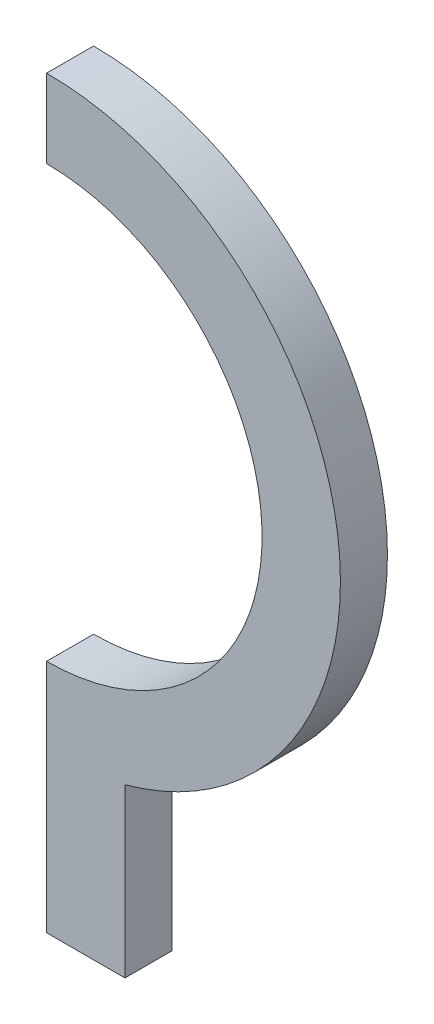
ISO-10303-21;
HEADER;
FILE_DESCRIPTION(('STEP AP214'),'2;1');
FILE_NAME('part.step','',(''),(''),'','','');
FILE_SCHEMA(('AUTOMOTIVE_DESIGN { 1 0 10303 214 1 1 1 1 }'));
ENDSEC;
DATA;
#1=APPLICATION_CONTEXT('core data for automotive mechanical design processes');
#2=APPLICATION_PROTOCOL_DEFINITION('international standard','automotive_design',2000,#1);
#3=PRODUCT_CONTEXT('',#1,'mechanical');
#4=PRODUCT('Part','Part','',(#3));
#5=PRODUCT_RELATED_PRODUCT_CATEGORY('part','',(#4));
#6=PRODUCT_DEFINITION_FORMATION('','',#4);
#7=PRODUCT_DEFINITION_CONTEXT('part definition',#1,'design');
#8=PRODUCT_DEFINITION('design','',#6,#7);
#9=PRODUCT_DEFINITION_SHAPE('','',#8);
#10=(LENGTH_UNIT() NAMED_UNIT(*) SI_UNIT(.MILLI.,.METRE.));
#11=(NAMED_UNIT(*) PLANE_ANGLE_UNIT() SI_UNIT($,.RADIAN.));
#12=(NAMED_UNIT(*) SI_UNIT($,.STERADIAN.) SOLID_ANGLE_UNIT());
#13=UNCERTAINTY_MEASURE_WITH_UNIT(LENGTH_MEASURE(1.E-05),#10,'distance_accuracy_value','');
#14=(GEOMETRIC_REPRESENTATION_CONTEXT(3) GLOBAL_UNCERTAINTY_ASSIGNED_CONTEXT((#13)) GLOBAL_UNIT_ASSIGNED_CONTEXT((#10,
#11,#12)) REPRESENTATION_CONTEXT('',''));
#15=CARTESIAN_POINT('',(0.,0.,0.));
#16=DIRECTION('',(0.,0.,1.));
#17=DIRECTION('',(1.,0.,0.));
#18=AXIS2_PLACEMENT_3D('',#15,#16,#17);
#19=CARTESIAN_POINT('',(5.,-10.,6.));
#20=DIRECTION('',(0.,1.,0.));
#21=DIRECTION('',(0.,0.,1.));
#22=AXIS2_PLACEMENT_3D('',#19,#20,#21);
#23=PLANE('',#22);
#24=DIRECTION('',(1.,0.,0.));
#25=VECTOR('',#24,1.);
#26=CARTESIAN_POINT('',(5.,-10.,0.));
#27=LINE('',#26,#25);
#28=CARTESIAN_POINT('',(-5.,-10.,0.));
#29=VERTEX_POINT('',#28);
#30=CARTESIAN_POINT('',(5.,-10.,0.));
#31=VERTEX_POINT('',#30);
#32=EDGE_CURVE('E135',#29,#31,#27,.T.);
#33=ORIENTED_EDGE('',*,*,#32,.T.);
#34=DIRECTION('',(0.,0.,-1.));
#35=VECTOR('',#34,1.);
#36=CARTESIAN_POINT('',(5.,-10.,6.));
#37=LINE('',#36,#35);
#38=CARTESIAN_POINT('',(5.,-10.,6.));
#39=VERTEX_POINT('',#38);
#40=EDGE_CURVE('E11',#39,#31,#37,.T.);
#41=ORIENTED_EDGE('',*,*,#40,.F.);
#42=DIRECTION('',(1.,0.,0.));
#43=VECTOR('',#42,1.);
#44=CARTESIAN_POINT('',(5.,-10.,6.));
#45=LINE('',#44,#43);
#46=CARTESIAN_POINT('',(-5.,-10.,6.));
#47=VERTEX_POINT('',#46);
#48=EDGE_CURVE('E152',#47,#39,#45,.T.);
#49=ORIENTED_EDGE('',*,*,#48,.F.);
#50=DIRECTION('',(0.,0.,-1.));
#51=VECTOR('',#50,1.);
#52=CARTESIAN_POINT('',(-5.,-10.,6.));
#53=LINE('',#52,#51);
#54=EDGE_CURVE('E131',#47,#29,#53,.T.);
#55=ORIENTED_EDGE('',*,*,#54,.T.);
#56=EDGE_LOOP('',(#33,#41,#49,#55));
#57=FACE_BOUND('',#56,.T.);
#58=ADVANCED_FACE('F45',(#57),#23,.F.);
#59=CARTESIAN_POINT('',(5.,10.,6.));
#60=DIRECTION('',(-1.,0.,0.));
#61=DIRECTION('',(0.,0.,1.));
#62=AXIS2_PLACEMENT_3D('',#59,#60,#61);
#63=PLANE('',#62);
#64=DIRECTION('',(0.,1.,0.));
#65=VECTOR('',#64,1.);
#66=CARTESIAN_POINT('',(5.,10.,0.));
#67=LINE('',#66,#65);
#68=CARTESIAN_POINT('',(4.99999999999998,11.3579192629976,0.));
#69=VERTEX_POINT('',#68);
#70=EDGE_CURVE('E139',#31,#69,#67,.T.);
#71=ORIENTED_EDGE('',*,*,#70,.T.);
#72=DIRECTION('',(0.,0.,-1.));
#73=VECTOR('',#72,1.);
#74=CARTESIAN_POINT('',(4.99999999999998,11.3579192629976,6.));
#75=LINE('',#74,#73);
#76=CARTESIAN_POINT('',(4.99999999999998,11.3579192629976,6.));
#77=VERTEX_POINT('',#76);
#78=EDGE_CURVE('E54',#77,#69,#75,.T.);
#79=ORIENTED_EDGE('',*,*,#78,.F.);
#80=DIRECTION('',(0.,1.,0.));
#81=VECTOR('',#80,1.);
#82=CARTESIAN_POINT('',(5.,10.,6.));
#83=LINE('',#82,#81);
#84=EDGE_CURVE('E97',#39,#77,#83,.T.);
#85=ORIENTED_EDGE('',*,*,#84,.F.);
#86=ORIENTED_EDGE('',*,*,#40,.T.);
#87=EDGE_LOOP('',(#71,#79,#85,#86));
#88=FACE_BOUND('',#87,.T.);
#89=ADVANCED_FACE('F173',(#88),#63,.F.);
#90=CARTESIAN_POINT('',(-5.00000000000002,47.5,6.));
#91=DIRECTION('',(0.,0.,-1.));
#92=DIRECTION('',(-1.,0.,0.));
#93=AXIS2_PLACEMENT_3D('',#90,#91,#92);
#94=CYLINDRICAL_SURFACE('',#93,37.5);
#95=CARTESIAN_POINT('',(-5.00000000000002,47.5,0.));
#96=DIRECTION('',(0.,0.,1.));
#97=DIRECTION('',(1.,0.,0.));
#98=AXIS2_PLACEMENT_3D('',#95,#96,#97);
#99=CIRCLE('',#98,37.5);
#100=CARTESIAN_POINT('',(-5.00000000000001,85.,0.));
#101=VERTEX_POINT('',#100);
#102=EDGE_CURVE('E142',#69,#101,#99,.T.);
#103=ORIENTED_EDGE('',*,*,#102,.T.);
#104=DIRECTION('',(0.,0.,-1.));
#105=VECTOR('',#104,1.);
#106=CARTESIAN_POINT('',(-5.00000000000001,85.,6.));
#107=LINE('',#106,#105);
#108=CARTESIAN_POINT('',(-5.00000000000001,85.,6.));
#109=VERTEX_POINT('',#108);
#110=EDGE_CURVE('E124',#109,#101,#107,.T.);
#111=ORIENTED_EDGE('',*,*,#110,.F.);
#112=CARTESIAN_POINT('',(-5.00000000000002,47.5,6.));
#113=DIRECTION('',(0.,0.,1.));
#114=DIRECTION('',(1.,0.,0.));
#115=AXIS2_PLACEMENT_3D('',#112,#113,#114);
#116=CIRCLE('',#115,37.5);
#117=EDGE_CURVE('E111',#77,#109,#116,.T.);
#118=ORIENTED_EDGE('',*,*,#117,.F.);
#119=ORIENTED_EDGE('',*,*,#78,.T.);
#120=EDGE_LOOP('',(#103,#111,#118,#119));
#121=FACE_BOUND('',#120,.T.);
#122=ADVANCED_FACE('F162',(#121),#94,.T.);
#123=CARTESIAN_POINT('',(-5.00000000000001,75.,6.));
#124=DIRECTION('',(1.,0.,0.));
#125=DIRECTION('',(0.,0.,-1.));
#126=AXIS2_PLACEMENT_3D('',#123,#124,#125);
#127=PLANE('',#126);
#128=DIRECTION('',(0.,-1.,0.));
#129=VECTOR('',#128,1.);
#130=CARTESIAN_POINT('',(-5.00000000000001,75.,0.));
#131=LINE('',#130,#129);
#132=CARTESIAN_POINT('',(-5.00000000000001,75.,0.));
#133=VERTEX_POINT('',#132);
#134=EDGE_CURVE('E121',#101,#133,#131,.T.);
#135=ORIENTED_EDGE('',*,*,#134,.T.);
#136=DIRECTION('',(0.,0.,-1.));
#137=VECTOR('',#136,1.);
#138=CARTESIAN_POINT('',(-5.00000000000001,75.,6.));
#139=LINE('',#138,#137);
#140=CARTESIAN_POINT('',(-5.00000000000001,75.,6.));
#141=VERTEX_POINT('',#140);
#142=EDGE_CURVE('E118',#141,#133,#139,.T.);
#143=ORIENTED_EDGE('',*,*,#142,.F.);
#144=DIRECTION('',(0.,-1.,0.));
#145=VECTOR('',#144,1.);
#146=CARTESIAN_POINT('',(-5.00000000000001,75.,6.));
#147=LINE('',#146,#145);
#148=EDGE_CURVE('E104',#109,#141,#147,.T.);
#149=ORIENTED_EDGE('',*,*,#148,.F.);
#150=ORIENTED_EDGE('',*,*,#110,.T.);
#151=EDGE_LOOP('',(#135,#143,#149,#150));
#152=FACE_BOUND('',#151,.T.);
#153=ADVANCED_FACE('F119',(#152),#127,.F.);
#154=CARTESIAN_POINT('',(-5.00000000000002,47.5,6.));
#155=DIRECTION('',(0.,0.,-1.));
#156=DIRECTION('',(-1.,0.,0.));
#157=AXIS2_PLACEMENT_3D('',#154,#155,#156);
#158=CYLINDRICAL_SURFACE('',#157,27.5);
#159=CARTESIAN_POINT('',(-5.00000000000002,47.5,0.));
#160=DIRECTION('',(0.,0.,-1.));
#161=DIRECTION('',(1.,0.,0.));
#162=AXIS2_PLACEMENT_3D('',#159,#160,#161);
#163=CIRCLE('',#162,27.5);
#164=CARTESIAN_POINT('',(-5.,20.,0.));
#165=VERTEX_POINT('',#164);
#166=EDGE_CURVE('E147',#133,#165,#163,.T.);
#167=ORIENTED_EDGE('',*,*,#166,.T.);
#168=DIRECTION('',(0.,0.,-1.));
#169=VECTOR('',#168,1.);
#170=CARTESIAN_POINT('',(-5.,20.,6.));
#171=LINE('',#170,#169);
#172=CARTESIAN_POINT('',(-5.,20.,6.));
#173=VERTEX_POINT('',#172);
#174=EDGE_CURVE('E125',#173,#165,#171,.T.);
#175=ORIENTED_EDGE('',*,*,#174,.F.);
#176=CARTESIAN_POINT('',(-5.00000000000002,47.5,6.));
#177=DIRECTION('',(0.,0.,-1.));
#178=DIRECTION('',(1.,0.,0.));
#179=AXIS2_PLACEMENT_3D('',#176,#177,#178);
#180=CIRCLE('',#179,27.5);
#181=EDGE_CURVE('E108',#141,#173,#180,.T.);
#182=ORIENTED_EDGE('',*,*,#181,.F.);
#183=ORIENTED_EDGE('',*,*,#142,.T.);
#184=EDGE_LOOP('',(#167,#175,#182,#183));
#185=FACE_BOUND('',#184,.T.);
#186=ADVANCED_FACE('F127',(#185),#158,.F.);
#187=CARTESIAN_POINT('',(-5.,10.,6.));
#188=DIRECTION('',(1.,0.,0.));
#189=DIRECTION('',(0.,1.,0.));
#190=AXIS2_PLACEMENT_3D('',#187,#188,#189);
#191=PLANE('',#190);
#192=DIRECTION('',(0.,-1.,0.));
#193=VECTOR('',#192,1.);
#194=CARTESIAN_POINT('',(-5.,10.,0.));
#195=LINE('',#194,#193);
#196=EDGE_CURVE('E85',#165,#29,#195,.T.);
#197=ORIENTED_EDGE('',*,*,#196,.T.);
#198=ORIENTED_EDGE('',*,*,#54,.F.);
#199=DIRECTION('',(0.,-1.,0.));
#200=VECTOR('',#199,1.);
#201=CARTESIAN_POINT('',(-5.,10.,6.));
#202=LINE('',#201,#200);
#203=EDGE_CURVE('E62',#173,#47,#202,.T.);
#204=ORIENTED_EDGE('',*,*,#203,.F.);
#205=ORIENTED_EDGE('',*,*,#174,.T.);
#206=EDGE_LOOP('',(#197,#198,#204,#205));
#207=FACE_BOUND('',#206,.T.);
#208=ADVANCED_FACE('F164',(#207),#191,.F.);
#209=CARTESIAN_POINT('',(-5.00000000000002,47.5,6.));
#210=DIRECTION('',(0.,0.,1.));
#211=DIRECTION('',(1.,0.,0.));
#212=AXIS2_PLACEMENT_3D('',#209,#210,#211);
#213=PLANE('',#212);
#214=ORIENTED_EDGE('',*,*,#48,.T.);
#215=ORIENTED_EDGE('',*,*,#84,.T.);
#216=ORIENTED_EDGE('',*,*,#117,.T.);
#217=ORIENTED_EDGE('',*,*,#148,.T.);
#218=ORIENTED_EDGE('',*,*,#181,.T.);
#219=ORIENTED_EDGE('',*,*,#203,.T.);
#220=EDGE_LOOP('',(#214,#215,#216,#217,#218,#219));
#221=FACE_BOUND('',#220,.T.);
#222=ADVANCED_FACE('F106',(#221),#213,.T.);
#223=CARTESIAN_POINT('',(-5.00000000000002,47.5,0.));
#224=DIRECTION('',(0.,0.,1.));
#225=DIRECTION('',(1.,0.,0.));
#226=AXIS2_PLACEMENT_3D('',#223,#224,#225);
#227=PLANE('',#226);
#228=ORIENTED_EDGE('',*,*,#32,.F.);
#229=ORIENTED_EDGE('',*,*,#196,.F.);
#230=ORIENTED_EDGE('',*,*,#166,.F.);
#231=ORIENTED_EDGE('',*,*,#134,.F.);
#232=ORIENTED_EDGE('',*,*,#102,.F.);
#233=ORIENTED_EDGE('',*,*,#70,.F.);
#234=EDGE_LOOP('',(#228,#229,#230,#231,#232,#233));
#235=FACE_BOUND('',#234,.T.);
#236=ADVANCED_FACE('F163',(#235),#227,.F.);
#237=CLOSED_SHELL('',(#58,#89,#122,#153,#186,#208,#222,#236));
#238=MANIFOLD_SOLID_BREP('B2',#237);
#239=ADVANCED_BREP_SHAPE_REPRESENTATION('',(#18,#238),#14);
#240=SHAPE_DEFINITION_REPRESENTATION(#9,#239);
ENDSEC;
END-ISO-10303-21;
